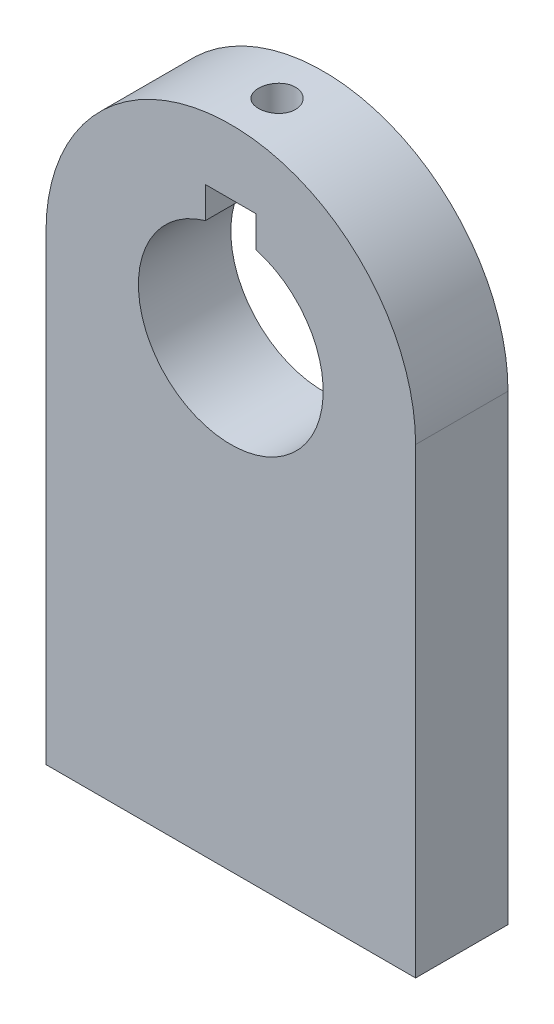
ISO-10303-21;
HEADER;
FILE_DESCRIPTION(('STEP AP214'),'2;1');
FILE_NAME('part.step','',(''),(''),'','','');
FILE_SCHEMA(('AUTOMOTIVE_DESIGN { 1 0 10303 214 1 1 1 1 }'));
ENDSEC;
DATA;
#1=APPLICATION_CONTEXT('core data for automotive mechanical design processes');
#2=APPLICATION_PROTOCOL_DEFINITION('international standard','automotive_design',2000,#1);
#3=PRODUCT_CONTEXT('',#1,'mechanical');
#4=PRODUCT('Part','Part','',(#3));
#5=PRODUCT_RELATED_PRODUCT_CATEGORY('part','',(#4));
#6=PRODUCT_DEFINITION_FORMATION('','',#4);
#7=PRODUCT_DEFINITION_CONTEXT('part definition',#1,'design');
#8=PRODUCT_DEFINITION('design','',#6,#7);
#9=PRODUCT_DEFINITION_SHAPE('','',#8);
#10=(LENGTH_UNIT() NAMED_UNIT(*) SI_UNIT(.MILLI.,.METRE.));
#11=(NAMED_UNIT(*) PLANE_ANGLE_UNIT() SI_UNIT($,.RADIAN.));
#12=(NAMED_UNIT(*) SI_UNIT($,.STERADIAN.) SOLID_ANGLE_UNIT());
#13=UNCERTAINTY_MEASURE_WITH_UNIT(LENGTH_MEASURE(1.E-05),#10,'distance_accuracy_value','');
#14=(GEOMETRIC_REPRESENTATION_CONTEXT(3) GLOBAL_UNCERTAINTY_ASSIGNED_CONTEXT((#13)) GLOBAL_UNIT_ASSIGNED_CONTEXT((#10,
#11,#12)) REPRESENTATION_CONTEXT('',''));
#15=CARTESIAN_POINT('',(0.,0.,0.));
#16=DIRECTION('',(0.,0.,1.));
#17=DIRECTION('',(1.,0.,0.));
#18=AXIS2_PLACEMENT_3D('',#15,#16,#17);
#19=CARTESIAN_POINT('',(0.,0.,10.));
#20=DIRECTION('',(0.,0.,-1.));
#21=DIRECTION('',(-1.,0.,0.));
#22=AXIS2_PLACEMENT_3D('',#19,#20,#21);
#23=PLANE('',#22);
#24=CARTESIAN_POINT('',(0.,0.,10.));
#25=DIRECTION('',(0.,0.,1.));
#26=DIRECTION('',(-1.,0.,0.));
#27=AXIS2_PLACEMENT_3D('',#24,#25,#26);
#28=CIRCLE('',#27,20.);
#29=CARTESIAN_POINT('',(20.,0.,10.));
#30=VERTEX_POINT('',#29);
#31=CARTESIAN_POINT('',(-20.,0.,10.));
#32=VERTEX_POINT('',#31);
#33=EDGE_CURVE('E145',#30,#32,#28,.T.);
#34=ORIENTED_EDGE('',*,*,#33,.T.);
#35=DIRECTION('',(0.,-1.,0.));
#36=VECTOR('',#35,1.);
#37=CARTESIAN_POINT('',(-20.,0.,10.));
#38=LINE('',#37,#36);
#39=CARTESIAN_POINT('',(-20.,-50.,10.));
#40=VERTEX_POINT('',#39);
#41=EDGE_CURVE('E89',#32,#40,#38,.T.);
#42=ORIENTED_EDGE('',*,*,#41,.T.);
#43=DIRECTION('',(1.,0.,0.));
#44=VECTOR('',#43,1.);
#45=CARTESIAN_POINT('',(-20.,-50.,10.));
#46=LINE('',#45,#44);
#47=CARTESIAN_POINT('',(20.,-50.,10.));
#48=VERTEX_POINT('',#47);
#49=EDGE_CURVE('E148',#40,#48,#46,.T.);
#50=ORIENTED_EDGE('',*,*,#49,.T.);
#51=DIRECTION('',(0.,1.,0.));
#52=VECTOR('',#51,1.);
#53=CARTESIAN_POINT('',(20.,-50.,10.));
#54=LINE('',#53,#52);
#55=EDGE_CURVE('E60',#48,#30,#54,.T.);
#56=ORIENTED_EDGE('',*,*,#55,.T.);
#57=EDGE_LOOP('',(#34,#42,#50,#56));
#58=FACE_BOUND('',#57,.T.);
#59=DIRECTION('',(-1.,0.,0.));
#60=VECTOR('',#59,1.);
#61=CARTESIAN_POINT('',(-2.75,13.,10.));
#62=LINE('',#61,#60);
#63=CARTESIAN_POINT('',(2.75,13.,10.));
#64=VERTEX_POINT('',#63);
#65=CARTESIAN_POINT('',(-2.75,13.,10.));
#66=VERTEX_POINT('',#65);
#67=EDGE_CURVE('E115',#64,#66,#62,.T.);
#68=ORIENTED_EDGE('',*,*,#67,.F.);
#69=DIRECTION('',(0.,1.,0.));
#70=VECTOR('',#69,1.);
#71=CARTESIAN_POINT('',(2.75,13.,10.));
#72=LINE('',#71,#70);
#73=CARTESIAN_POINT('',(2.75,9.6144422615147,10.));
#74=VERTEX_POINT('',#73);
#75=EDGE_CURVE('E122',#74,#64,#72,.T.);
#76=ORIENTED_EDGE('',*,*,#75,.F.);
#77=CARTESIAN_POINT('',(0.,0.,10.));
#78=DIRECTION('',(0.,0.,1.));
#79=DIRECTION('',(1.,0.,0.));
#80=AXIS2_PLACEMENT_3D('',#77,#78,#79);
#81=CIRCLE('',#80,10.);
#82=CARTESIAN_POINT('',(-2.75,9.6144422615147,10.));
#83=VERTEX_POINT('',#82);
#84=EDGE_CURVE('E140',#83,#74,#81,.T.);
#85=ORIENTED_EDGE('',*,*,#84,.F.);
#86=DIRECTION('',(0.,-1.,0.));
#87=VECTOR('',#86,1.);
#88=CARTESIAN_POINT('',(-2.75,13.,10.));
#89=LINE('',#88,#87);
#90=EDGE_CURVE('E51',#66,#83,#89,.T.);
#91=ORIENTED_EDGE('',*,*,#90,.F.);
#92=EDGE_LOOP('',(#68,#76,#85,#91));
#93=FACE_BOUND('',#92,.T.);
#94=ADVANCED_FACE('F35',(#58,#93),#23,.F.);
#95=CARTESIAN_POINT('',(0.,0.,0.));
#96=DIRECTION('',(0.,0.,-1.));
#97=DIRECTION('',(-1.,0.,0.));
#98=AXIS2_PLACEMENT_3D('',#95,#96,#97);
#99=PLANE('',#98);
#100=DIRECTION('',(0.,-1.,0.));
#101=VECTOR('',#100,1.);
#102=CARTESIAN_POINT('',(2.75,0.,0.));
#103=LINE('',#102,#101);
#104=CARTESIAN_POINT('',(2.75,13.,0.));
#105=VERTEX_POINT('',#104);
#106=CARTESIAN_POINT('',(2.75,9.6144422615147,0.));
#107=VERTEX_POINT('',#106);
#108=EDGE_CURVE('E137',#105,#107,#103,.T.);
#109=ORIENTED_EDGE('',*,*,#108,.F.);
#110=DIRECTION('',(1.,0.,0.));
#111=VECTOR('',#110,1.);
#112=CARTESIAN_POINT('',(0.,13.,0.));
#113=LINE('',#112,#111);
#114=CARTESIAN_POINT('',(-2.75,13.,0.));
#115=VERTEX_POINT('',#114);
#116=EDGE_CURVE('E11',#115,#105,#113,.T.);
#117=ORIENTED_EDGE('',*,*,#116,.F.);
#118=DIRECTION('',(0.,1.,0.));
#119=VECTOR('',#118,1.);
#120=CARTESIAN_POINT('',(-2.75,0.,0.));
#121=LINE('',#120,#119);
#122=CARTESIAN_POINT('',(-2.75,9.61444226151471,0.));
#123=VERTEX_POINT('',#122);
#124=EDGE_CURVE('E134',#123,#115,#121,.T.);
#125=ORIENTED_EDGE('',*,*,#124,.F.);
#126=CARTESIAN_POINT('',(0.,0.,0.));
#127=DIRECTION('',(0.,0.,1.));
#128=DIRECTION('',(1.,0.,0.));
#129=AXIS2_PLACEMENT_3D('',#126,#127,#128);
#130=CIRCLE('',#129,10.);
#131=EDGE_CURVE('E139',#123,#107,#130,.T.);
#132=ORIENTED_EDGE('',*,*,#131,.T.);
#133=EDGE_LOOP('',(#109,#117,#125,#132));
#134=FACE_BOUND('',#133,.T.);
#135=CARTESIAN_POINT('',(0.,0.,0.));
#136=DIRECTION('',(0.,0.,1.));
#137=DIRECTION('',(-1.,0.,0.));
#138=AXIS2_PLACEMENT_3D('',#135,#136,#137);
#139=CIRCLE('',#138,20.);
#140=CARTESIAN_POINT('',(20.,0.,0.));
#141=VERTEX_POINT('',#140);
#142=CARTESIAN_POINT('',(-20.,0.,0.));
#143=VERTEX_POINT('',#142);
#144=EDGE_CURVE('E142',#141,#143,#139,.T.);
#145=ORIENTED_EDGE('',*,*,#144,.F.);
#146=DIRECTION('',(0.,1.,0.));
#147=VECTOR('',#146,1.);
#148=CARTESIAN_POINT('',(20.,-50.,0.));
#149=LINE('',#148,#147);
#150=CARTESIAN_POINT('',(20.,-50.,0.));
#151=VERTEX_POINT('',#150);
#152=EDGE_CURVE('E81',#151,#141,#149,.T.);
#153=ORIENTED_EDGE('',*,*,#152,.F.);
#154=DIRECTION('',(1.,0.,0.));
#155=VECTOR('',#154,1.);
#156=CARTESIAN_POINT('',(-20.,-50.,0.));
#157=LINE('',#156,#155);
#158=CARTESIAN_POINT('',(-20.,-50.,0.));
#159=VERTEX_POINT('',#158);
#160=EDGE_CURVE('E156',#159,#151,#157,.T.);
#161=ORIENTED_EDGE('',*,*,#160,.F.);
#162=DIRECTION('',(0.,-1.,0.));
#163=VECTOR('',#162,1.);
#164=CARTESIAN_POINT('',(-20.,0.,0.));
#165=LINE('',#164,#163);
#166=EDGE_CURVE('E154',#143,#159,#165,.T.);
#167=ORIENTED_EDGE('',*,*,#166,.F.);
#168=EDGE_LOOP('',(#145,#153,#161,#167));
#169=FACE_BOUND('',#168,.T.);
#170=ADVANCED_FACE('F173',(#134,#169),#99,.T.);
#171=CARTESIAN_POINT('',(0.,0.,10.));
#172=DIRECTION('',(0.,0.,-1.));
#173=DIRECTION('',(-1.,0.,0.));
#174=AXIS2_PLACEMENT_3D('',#171,#172,#173);
#175=CYLINDRICAL_SURFACE('',#174,20.);
#176=CARTESIAN_POINT('',(0.,19.9999999999999,3.));
#177=CARTESIAN_POINT('',(0.112040707583117,19.9999987104153,3.00000485180076));
#178=CARTESIAN_POINT('',(0.224155490335548,19.999048511924,3.00944653779289));
#179=CARTESIAN_POINT('',(0.445276796993676,19.9953493518947,3.04696874058085));
#180=CARTESIAN_POINT('',(0.554279758337658,19.9925984086804,3.07506979204918));
#181=CARTESIAN_POINT('',(0.765943350906831,19.9856082912613,3.14908448119567));
#182=CARTESIAN_POINT('',(0.868607769229822,19.9813700160141,3.19498736103695));
#183=CARTESIAN_POINT('',(1.06475232192082,19.971879147886,3.30328181586329));
#184=CARTESIAN_POINT('',(1.15823427755816,19.9666267567626,3.36567011200028));
#185=CARTESIAN_POINT('',(1.33371910134817,19.9556748868264,3.50540539532455));
#186=CARTESIAN_POINT('',(1.41568428966979,19.9499740314772,3.58279959880407));
#187=CARTESIAN_POINT('',(1.56548504286197,19.9387791381252,3.75024906852606));
#188=CARTESIAN_POINT('',(1.63331995416531,19.9332851096983,3.84030492008478));
#189=CARTESIAN_POINT('',(1.75306794088724,19.9231118310556,4.03075706336724));
#190=CARTESIAN_POINT('',(1.80494693090976,19.918434334218,4.13117488818972));
#191=CARTESIAN_POINT('',(1.89109276948552,19.9104407509304,4.33935117180996));
#192=CARTESIAN_POINT('',(1.92536005318258,19.9071246308444,4.4471094491679));
#193=CARTESIAN_POINT('',(1.97519808320379,19.9022416814595,4.66652360173202));
#194=CARTESIAN_POINT('',(1.99083130600759,19.9006690079618,4.77816515370442));
#195=CARTESIAN_POINT('',(2.00315057027072,19.8994328612104,5.00249772679156));
#196=CARTESIAN_POINT('',(1.9998371097416,19.8997693377748,5.11518872024412));
#197=CARTESIAN_POINT('',(1.97440856050536,19.9023081379786,5.33799061938664));
#198=CARTESIAN_POINT('',(1.95236168824911,19.904503691813,5.44810939865739));
#199=CARTESIAN_POINT('',(1.89019828830117,19.9105026857483,5.66307592640219));
#200=CARTESIAN_POINT('',(1.85008151651149,19.9143061475698,5.76792360365006));
#201=CARTESIAN_POINT('',(1.75284178776302,19.9231001890413,5.96958717459778));
#202=CARTESIAN_POINT('',(1.69568856543996,19.9280928781631,6.06638837897863));
#203=CARTESIAN_POINT('',(1.56602005470646,19.9387010346575,6.24905042982377));
#204=CARTESIAN_POINT('',(1.49350431667301,19.9443165202556,6.33491095596353));
#205=CARTESIAN_POINT('',(1.33478822482414,19.9555677062597,6.49365078797805));
#206=CARTESIAN_POINT('',(1.24852895770273,19.9612033866599,6.56647120376161));
#207=CARTESIAN_POINT('',(1.06497896347423,19.9718365815703,6.69660726582078));
#208=CARTESIAN_POINT('',(0.967688223999203,19.9768340953651,6.75392289471295));
#209=CARTESIAN_POINT('',(0.76479621138473,19.9856295133418,6.85142004062051));
#210=CARTESIAN_POINT('',(0.659193492779807,19.9894272082953,6.89159856963612));
#211=CARTESIAN_POINT('',(0.442694434659865,19.9953929488281,6.9536378334235));
#212=CARTESIAN_POINT('',(0.331798253553202,19.9975610431412,6.97549911598125));
#213=CARTESIAN_POINT('',(0.108370198183809,20.0000170333661,7.00020861546953));
#214=CARTESIAN_POINT('',(-0.00415260421098242,20.0003129653546,7.003138096505));
#215=CARTESIAN_POINT('',(-0.228087586631398,19.9990128351359,6.99011427390247));
#216=CARTESIAN_POINT('',(-0.339499781640938,19.9974167984893,6.97416122536944));
#217=CARTESIAN_POINT('',(-0.557816413669347,19.9925172307838,6.92389260915685));
#218=CARTESIAN_POINT('',(-0.664729697944036,19.9892172383607,6.88961509104398));
#219=CARTESIAN_POINT('',(-0.871288642767561,19.9812799772121,6.80370965192546));
#220=CARTESIAN_POINT('',(-0.970934140314233,19.976642678505,6.7520813419212));
#221=CARTESIAN_POINT('',(-1.16049636034428,19.9665295066084,6.63273832267217));
#222=CARTESIAN_POINT('',(-1.25037931949783,19.9610508720687,6.56497022214837));
#223=CARTESIAN_POINT('',(-1.41752324662375,19.9498786573903,6.41534786451815));
#224=CARTESIAN_POINT('',(-1.49478389769835,19.9441850718594,6.33349325385937));
#225=CARTESIAN_POINT('',(-1.63477221977429,19.933200482815,6.157666850682));
#226=CARTESIAN_POINT('',(-1.69744655735908,19.9279110027794,6.06365248691476));
#227=CARTESIAN_POINT('',(-1.80611651748765,19.9183566492177,5.86638527970663));
#228=CARTESIAN_POINT('',(-1.85211236810776,19.9140917616807,5.76313256262321));
#229=CARTESIAN_POINT('',(-1.92603041736895,19.9070789526809,5.55050252106841));
#230=CARTESIAN_POINT('',(-1.95398434962372,19.9043283689957,5.44113631981776));
#231=CARTESIAN_POINT('',(-1.99112801425892,19.9006473056575,5.21923360407845));
#232=CARTESIAN_POINT('',(-2.00031828479903,19.8997167738037,5.10669718060865));
#233=CARTESIAN_POINT('',(-1.99966627694251,19.8997822621512,4.88217862328659));
#234=CARTESIAN_POINT('',(-1.98990777918622,19.9007698017401,4.77019623423437));
#235=CARTESIAN_POINT('',(-1.9518109059273,19.9045420777908,4.54947016566342));
#236=CARTESIAN_POINT('',(-1.92347250952432,19.9073268162743,4.44072648978804));
#237=CARTESIAN_POINT('',(-1.849043372595,19.9143773652637,4.22956530190429));
#238=CARTESIAN_POINT('',(-1.80295508868183,19.9186429708071,4.12714691674055));
#239=CARTESIAN_POINT('',(-1.69434310982208,19.9281750367871,3.93148621665793));
#240=CARTESIAN_POINT('',(-1.63181950691083,19.9334414916189,3.83824385035874));
#241=CARTESIAN_POINT('',(-1.49179711257066,19.9444097441939,3.66315265105613));
#242=CARTESIAN_POINT('',(-1.41423589778053,19.9501132945349,3.58135384726583));
#243=CARTESIAN_POINT('',(-1.24646339845022,19.9612970945756,3.43189553460068));
#244=CARTESIAN_POINT('',(-1.15624908821651,19.9667772904595,3.36423941728566));
#245=CARTESIAN_POINT('',(-0.965482868322576,19.9769112413832,3.24485309229076));
#246=CARTESIAN_POINT('',(-0.864905498693525,19.9815628805362,3.19316341810964));
#247=CARTESIAN_POINT('',(-0.656516558201099,19.9894925849979,3.10747515435226));
#248=CARTESIAN_POINT('',(-0.548713299651217,19.992772198193,3.07345661809291));
#249=CARTESIAN_POINT('',(-0.366916522811406,19.9967642754746,3.0325587658304));
#250=CARTESIAN_POINT('',(-0.294085105689015,19.9979720138366,3.02036591140129));
#251=CARTESIAN_POINT('',(-0.147513161634624,19.9995902990157,3.00408494787648));
#252=CARTESIAN_POINT('',(-0.0737726384531135,20.0000008491204,2.99999680535628));
#253=CARTESIAN_POINT('',(0.,19.9999999999999,3.));
#254=B_SPLINE_CURVE_WITH_KNOTS('',3,(#176,#177,#178,#179,#180,#181,#182,#183,#184,#185,#186,
#187,#188,#189,#190,#191,#192,#193,#194,#195,#196,#197,#198,#199,#200,#201,#202,#203,#204,#205,
#206,#207,#208,#209,#210,#211,#212,#213,#214,#215,#216,#217,#218,#219,#220,#221,#222,#223,#224,
#225,#226,#227,#228,#229,#230,#231,#232,#233,#234,#235,#236,#237,#238,#239,#240,#241,#242,#243,
#244,#245,#246,#247,#248,#249,#250,#251,#252,#253),.UNSPECIFIED.,.T.,.F.,(4,2,2,2,2,2,2,2,2,2,2,
2,2,2,2,2,2,2,2,2,2,2,2,2,2,2,2,2,2,2,2,2,2,2,2,2,2,2,4),(0.,0.335852732536947,
0.672075685670973,1.00809577146441,1.34404907516557,1.68107713724589,2.01812078441412,
2.35587950944444,2.69362988885008,3.03024464090393,3.36685054511553,3.70223594882221,
4.03762588323267,4.37361522745789,4.70961440662251,5.04709468392413,5.38457533959544,
5.72211481387163,6.05964419350879,6.39572377215515,6.73179881038287,7.0671787058861,
7.40256612098934,7.73907881497397,8.0755999562046,8.41333287217197,8.75106116950748,
9.08819381186006,9.42531678479171,9.76095258587913,10.0965887645208,10.432178507256,
10.7677663707792,11.1047783485531,11.4418710527392,11.7798126205248,12.1173718959059,
12.338513344647,12.5596538813805),.UNSPECIFIED.);
#255=CARTESIAN_POINT('',(0.,19.9999999999999,3.));
#256=VERTEX_POINT('',#255);
#257=EDGE_CURVE('E128',#256,#256,#254,.T.);
#258=ORIENTED_EDGE('',*,*,#257,.T.);
#259=EDGE_LOOP('',(#258));
#260=FACE_BOUND('',#259,.T.);
#261=ORIENTED_EDGE('',*,*,#144,.T.);
#262=DIRECTION('',(0.,0.,-1.));
#263=VECTOR('',#262,1.);
#264=CARTESIAN_POINT('',(-20.,0.,10.));
#265=LINE('',#264,#263);
#266=EDGE_CURVE('E165',#32,#143,#265,.T.);
#267=ORIENTED_EDGE('',*,*,#266,.F.);
#268=ORIENTED_EDGE('',*,*,#33,.F.);
#269=DIRECTION('',(0.,0.,-1.));
#270=VECTOR('',#269,1.);
#271=CARTESIAN_POINT('',(20.,0.,10.));
#272=LINE('',#271,#270);
#273=EDGE_CURVE('E151',#30,#141,#272,.T.);
#274=ORIENTED_EDGE('',*,*,#273,.T.);
#275=EDGE_LOOP('',(#261,#267,#268,#274));
#276=FACE_BOUND('',#275,.T.);
#277=ADVANCED_FACE('F37',(#260,#276),#175,.T.);
#278=CARTESIAN_POINT('',(-20.,0.,10.));
#279=DIRECTION('',(1.,0.,0.));
#280=DIRECTION('',(0.,0.,-1.));
#281=AXIS2_PLACEMENT_3D('',#278,#279,#280);
#282=PLANE('',#281);
#283=ORIENTED_EDGE('',*,*,#166,.T.);
#284=DIRECTION('',(0.,0.,-1.));
#285=VECTOR('',#284,1.);
#286=CARTESIAN_POINT('',(-20.,-50.,10.));
#287=LINE('',#286,#285);
#288=EDGE_CURVE('E162',#40,#159,#287,.T.);
#289=ORIENTED_EDGE('',*,*,#288,.F.);
#290=ORIENTED_EDGE('',*,*,#41,.F.);
#291=ORIENTED_EDGE('',*,*,#266,.T.);
#292=EDGE_LOOP('',(#283,#289,#290,#291));
#293=FACE_BOUND('',#292,.T.);
#294=ADVANCED_FACE('F194',(#293),#282,.F.);
#295=CARTESIAN_POINT('',(-20.,-50.,10.));
#296=DIRECTION('',(0.,1.,0.));
#297=DIRECTION('',(0.,0.,1.));
#298=AXIS2_PLACEMENT_3D('',#295,#296,#297);
#299=PLANE('',#298);
#300=ORIENTED_EDGE('',*,*,#160,.T.);
#301=DIRECTION('',(0.,0.,-1.));
#302=VECTOR('',#301,1.);
#303=CARTESIAN_POINT('',(20.,-50.,10.));
#304=LINE('',#303,#302);
#305=EDGE_CURVE('E160',#48,#151,#304,.T.);
#306=ORIENTED_EDGE('',*,*,#305,.F.);
#307=ORIENTED_EDGE('',*,*,#49,.F.);
#308=ORIENTED_EDGE('',*,*,#288,.T.);
#309=EDGE_LOOP('',(#300,#306,#307,#308));
#310=FACE_BOUND('',#309,.T.);
#311=ADVANCED_FACE('F184',(#310),#299,.F.);
#312=CARTESIAN_POINT('',(20.,-50.,10.));
#313=DIRECTION('',(-1.,0.,0.));
#314=DIRECTION('',(0.,0.,1.));
#315=AXIS2_PLACEMENT_3D('',#312,#313,#314);
#316=PLANE('',#315);
#317=ORIENTED_EDGE('',*,*,#152,.T.);
#318=ORIENTED_EDGE('',*,*,#273,.F.);
#319=ORIENTED_EDGE('',*,*,#55,.F.);
#320=ORIENTED_EDGE('',*,*,#305,.T.);
#321=EDGE_LOOP('',(#317,#318,#319,#320));
#322=FACE_BOUND('',#321,.T.);
#323=ADVANCED_FACE('F177',(#322),#316,.F.);
#324=CARTESIAN_POINT('',(0.,0.,10.));
#325=DIRECTION('',(0.,0.,-1.));
#326=DIRECTION('',(-1.,0.,0.));
#327=AXIS2_PLACEMENT_3D('',#324,#325,#326);
#328=CYLINDRICAL_SURFACE('',#327,10.);
#329=DIRECTION('',(0.,0.,-1.));
#330=VECTOR('',#329,1.);
#331=CARTESIAN_POINT('',(2.75,9.6144422615147,10.));
#332=LINE('',#331,#330);
#333=EDGE_CURVE('E44',#107,#74,#332,.F.);
#334=ORIENTED_EDGE('',*,*,#333,.F.);
#335=ORIENTED_EDGE('',*,*,#131,.F.);
#336=DIRECTION('',(0.,0.,-1.));
#337=VECTOR('',#336,1.);
#338=CARTESIAN_POINT('',(-2.75,9.61444226151471,10.));
#339=LINE('',#338,#337);
#340=EDGE_CURVE('E167',#83,#123,#339,.T.);
#341=ORIENTED_EDGE('',*,*,#340,.F.);
#342=ORIENTED_EDGE('',*,*,#84,.T.);
#343=EDGE_LOOP('',(#334,#335,#341,#342));
#344=FACE_BOUND('',#343,.T.);
#345=ADVANCED_FACE('F175',(#344),#328,.F.);
#346=CARTESIAN_POINT('',(2.75,13.,-0.999999999999999));
#347=DIRECTION('',(1.,0.,0.));
#348=DIRECTION('',(0.,1.,0.));
#349=AXIS2_PLACEMENT_3D('',#346,#347,#348);
#350=PLANE('',#349);
#351=ORIENTED_EDGE('',*,*,#108,.T.);
#352=ORIENTED_EDGE('',*,*,#333,.T.);
#353=ORIENTED_EDGE('',*,*,#75,.T.);
#354=DIRECTION('',(0.,0.,1.));
#355=VECTOR('',#354,1.);
#356=CARTESIAN_POINT('',(2.75,13.,-0.999999999999999));
#357=LINE('',#356,#355);
#358=EDGE_CURVE('E110',#105,#64,#357,.T.);
#359=ORIENTED_EDGE('',*,*,#358,.F.);
#360=EDGE_LOOP('',(#351,#352,#353,#359));
#361=FACE_BOUND('',#360,.T.);
#362=ADVANCED_FACE('F123',(#361),#350,.F.);
#363=CARTESIAN_POINT('',(-2.75,13.,-0.999999999999999));
#364=DIRECTION('',(-1.,0.,0.));
#365=DIRECTION('',(0.,-1.,0.));
#366=AXIS2_PLACEMENT_3D('',#363,#364,#365);
#367=PLANE('',#366);
#368=ORIENTED_EDGE('',*,*,#124,.T.);
#369=DIRECTION('',(0.,0.,1.));
#370=VECTOR('',#369,1.);
#371=CARTESIAN_POINT('',(-2.75,13.,-0.999999999999999));
#372=LINE('',#371,#370);
#373=EDGE_CURVE('E119',#115,#66,#372,.T.);
#374=ORIENTED_EDGE('',*,*,#373,.T.);
#375=ORIENTED_EDGE('',*,*,#90,.T.);
#376=ORIENTED_EDGE('',*,*,#340,.T.);
#377=EDGE_LOOP('',(#368,#374,#375,#376));
#378=FACE_BOUND('',#377,.T.);
#379=ADVANCED_FACE('F169',(#378),#367,.F.);
#380=CARTESIAN_POINT('',(-2.75,13.,-0.999999999999999));
#381=DIRECTION('',(0.,1.,0.));
#382=DIRECTION('',(0.,0.,1.));
#383=AXIS2_PLACEMENT_3D('',#380,#381,#382);
#384=PLANE('',#383);
#385=CARTESIAN_POINT('',(0.,13.,5.));
#386=DIRECTION('',(0.,-1.,0.));
#387=DIRECTION('',(0.,0.,-1.));
#388=AXIS2_PLACEMENT_3D('',#385,#386,#387);
#389=CIRCLE('',#388,2.);
#390=CARTESIAN_POINT('',(0.,13.,3.));
#391=VERTEX_POINT('',#390);
#392=EDGE_CURVE('E213',#391,#391,#389,.T.);
#393=ORIENTED_EDGE('',*,*,#392,.F.);
#394=EDGE_LOOP('',(#393));
#395=FACE_BOUND('',#394,.T.);
#396=ORIENTED_EDGE('',*,*,#116,.T.);
#397=ORIENTED_EDGE('',*,*,#358,.T.);
#398=ORIENTED_EDGE('',*,*,#67,.T.);
#399=ORIENTED_EDGE('',*,*,#373,.F.);
#400=EDGE_LOOP('',(#396,#397,#398,#399));
#401=FACE_BOUND('',#400,.T.);
#402=ADVANCED_FACE('F112',(#395,#401),#384,.F.);
#403=CARTESIAN_POINT('',(0.,20.,5.));
#404=DIRECTION('',(0.,-1.,0.));
#405=DIRECTION('',(0.,0.,-1.));
#406=AXIS2_PLACEMENT_3D('',#403,#404,#405);
#407=CYLINDRICAL_SURFACE('',#406,2.);
#408=ORIENTED_EDGE('',*,*,#392,.T.);
#409=EDGE_LOOP('',(#408));
#410=FACE_BOUND('',#409,.T.);
#411=ORIENTED_EDGE('',*,*,#257,.F.);
#412=EDGE_LOOP('',(#411));
#413=FACE_BOUND('',#412,.T.);
#414=ADVANCED_FACE('F220',(#410,#413),#407,.F.);
#415=CLOSED_SHELL('',(#94,#170,#277,#294,#311,#323,#345,#362,#379,#402,#414));
#416=MANIFOLD_SOLID_BREP('B2',#415);
#417=ADVANCED_BREP_SHAPE_REPRESENTATION('',(#18,#416),#14);
#418=SHAPE_DEFINITION_REPRESENTATION(#9,#417);
ENDSEC;
END-ISO-10303-21;
